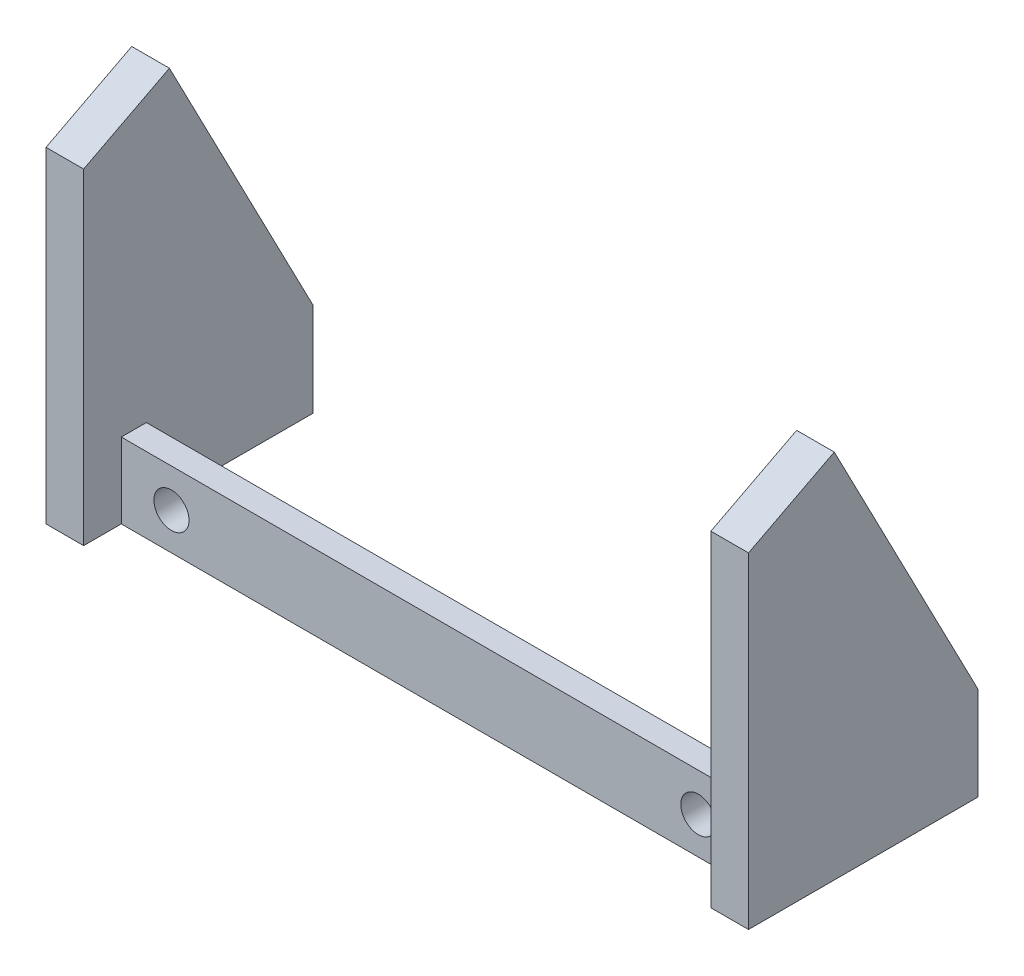
ISO-10303-21;
HEADER;
FILE_DESCRIPTION(('STEP AP214'),'2;1');
FILE_NAME('part.step','',(''),(''),'','','');
FILE_SCHEMA(('AUTOMOTIVE_DESIGN { 1 0 10303 214 1 1 1 1 }'));
ENDSEC;
DATA;
#1=APPLICATION_CONTEXT('core data for automotive mechanical design processes');
#2=APPLICATION_PROTOCOL_DEFINITION('international standard','automotive_design',2000,#1);
#3=PRODUCT_CONTEXT('',#1,'mechanical');
#4=PRODUCT('Part','Part','',(#3));
#5=PRODUCT_RELATED_PRODUCT_CATEGORY('part','',(#4));
#6=PRODUCT_DEFINITION_FORMATION('','',#4);
#7=PRODUCT_DEFINITION_CONTEXT('part definition',#1,'design');
#8=PRODUCT_DEFINITION('design','',#6,#7);
#9=PRODUCT_DEFINITION_SHAPE('','',#8);
#10=(LENGTH_UNIT() NAMED_UNIT(*) SI_UNIT(.MILLI.,.METRE.));
#11=(NAMED_UNIT(*) PLANE_ANGLE_UNIT() SI_UNIT($,.RADIAN.));
#12=(NAMED_UNIT(*) SI_UNIT($,.STERADIAN.) SOLID_ANGLE_UNIT());
#13=UNCERTAINTY_MEASURE_WITH_UNIT(LENGTH_MEASURE(1.E-05),#10,'distance_accuracy_value','');
#14=(GEOMETRIC_REPRESENTATION_CONTEXT(3) GLOBAL_UNCERTAINTY_ASSIGNED_CONTEXT((#13)) GLOBAL_UNIT_ASSIGNED_CONTEXT((#10,
#11,#12)) REPRESENTATION_CONTEXT('',''));
#15=CARTESIAN_POINT('',(0.,0.,0.));
#16=DIRECTION('',(0.,0.,1.));
#17=DIRECTION('',(1.,0.,0.));
#18=AXIS2_PLACEMENT_3D('',#15,#16,#17);
#19=CARTESIAN_POINT('',(3.,81.5205427840225,47.1061323483596));
#20=DIRECTION('',(0.,-0.887763580459995,-0.460299712371026));
#21=DIRECTION('',(0.,0.460299712371026,-0.887763580459995));
#22=AXIS2_PLACEMENT_3D('',#19,#20,#21);
#23=PLANE('',#22);
#24=DIRECTION('',(0.,-0.460299712371026,0.887763580459995));
#25=VECTOR('',#24,1.);
#26=CARTESIAN_POINT('',(0.,81.5205427840225,47.1061323483596));
#27=LINE('',#26,#25);
#28=CARTESIAN_POINT('',(0.,81.5205427840225,47.1061323483596));
#29=VERTEX_POINT('',#28);
#30=CARTESIAN_POINT('',(0.,77.9762349987656,53.9419119179015));
#31=VERTEX_POINT('',#30);
#32=EDGE_CURVE('E190',#29,#31,#27,.T.);
#33=ORIENTED_EDGE('',*,*,#32,.T.);
#34=DIRECTION('',(-1.,0.,0.));
#35=VECTOR('',#34,1.);
#36=CARTESIAN_POINT('',(3.,77.9762349987656,53.9419119179015));
#37=LINE('',#36,#35);
#38=CARTESIAN_POINT('',(3.,77.9762349987656,53.9419119179015));
#39=VERTEX_POINT('',#38);
#40=EDGE_CURVE('E11',#39,#31,#37,.T.);
#41=ORIENTED_EDGE('',*,*,#40,.F.);
#42=DIRECTION('',(0.,-0.460299712371026,0.887763580459995));
#43=VECTOR('',#42,1.);
#44=CARTESIAN_POINT('',(3.,81.5205427840225,47.1061323483596));
#45=LINE('',#44,#43);
#46=CARTESIAN_POINT('',(3.,81.5205427840225,47.1061323483596));
#47=VERTEX_POINT('',#46);
#48=EDGE_CURVE('E196',#47,#39,#45,.T.);
#49=ORIENTED_EDGE('',*,*,#48,.F.);
#50=DIRECTION('',(-1.,0.,0.));
#51=VECTOR('',#50,1.);
#52=CARTESIAN_POINT('',(3.,81.5205427840225,47.1061323483596));
#53=LINE('',#52,#51);
#54=EDGE_CURVE('E209',#47,#29,#53,.T.);
#55=ORIENTED_EDGE('',*,*,#54,.T.);
#56=EDGE_LOOP('',(#33,#41,#49,#55));
#57=FACE_BOUND('',#56,.T.);
#58=ADVANCED_FACE('F41',(#57),#23,.F.);
#59=CARTESIAN_POINT('',(3.,51.9762349987656,53.9419119179015));
#60=DIRECTION('',(0.,0.,-1.));
#61=DIRECTION('',(-1.,0.,0.));
#62=AXIS2_PLACEMENT_3D('',#59,#60,#61);
#63=PLANE('',#62);
#64=DIRECTION('',(0.,-1.,0.));
#65=VECTOR('',#64,1.);
#66=CARTESIAN_POINT('',(0.,51.9762349987656,53.9419119179015));
#67=LINE('',#66,#65);
#68=CARTESIAN_POINT('',(0.,51.9762349987656,53.9419119179015));
#69=VERTEX_POINT('',#68);
#70=EDGE_CURVE('E212',#31,#69,#67,.T.);
#71=ORIENTED_EDGE('',*,*,#70,.T.);
#72=DIRECTION('',(-1.,0.,0.));
#73=VECTOR('',#72,1.);
#74=CARTESIAN_POINT('',(3.,51.9762349987656,53.9419119179015));
#75=LINE('',#74,#73);
#76=CARTESIAN_POINT('',(3.,51.9762349987656,53.9419119179015));
#77=VERTEX_POINT('',#76);
#78=EDGE_CURVE('E48',#77,#69,#75,.T.);
#79=ORIENTED_EDGE('',*,*,#78,.F.);
#80=DIRECTION('',(0.,-1.,0.));
#81=VECTOR('',#80,1.);
#82=CARTESIAN_POINT('',(3.,51.9762349987656,53.9419119179015));
#83=LINE('',#82,#81);
#84=EDGE_CURVE('E199',#39,#77,#83,.T.);
#85=ORIENTED_EDGE('',*,*,#84,.F.);
#86=ORIENTED_EDGE('',*,*,#40,.T.);
#87=EDGE_LOOP('',(#71,#79,#85,#86));
#88=FACE_BOUND('',#87,.T.);
#89=ADVANCED_FACE('F299',(#88),#63,.F.);
#90=CARTESIAN_POINT('',(3.,51.9762349987656,35.6483878504032));
#91=DIRECTION('',(0.,1.,0.));
#92=DIRECTION('',(0.,0.,1.));
#93=AXIS2_PLACEMENT_3D('',#90,#91,#92);
#94=PLANE('',#93);
#95=DIRECTION('',(0.,0.,-1.));
#96=VECTOR('',#95,1.);
#97=CARTESIAN_POINT('',(0.,51.9762349987656,35.6483878504032));
#98=LINE('',#97,#96);
#99=CARTESIAN_POINT('',(0.,51.9762349987656,35.6483878504032));
#100=VERTEX_POINT('',#99);
#101=EDGE_CURVE('E214',#69,#100,#98,.T.);
#102=ORIENTED_EDGE('',*,*,#101,.T.);
#103=DIRECTION('',(-1.,0.,0.));
#104=VECTOR('',#103,1.);
#105=CARTESIAN_POINT('',(3.,51.9762349987656,35.6483878504032));
#106=LINE('',#105,#104);
#107=CARTESIAN_POINT('',(3.,51.9762349987656,35.6483878504032));
#108=VERTEX_POINT('',#107);
#109=EDGE_CURVE('E224',#108,#100,#106,.T.);
#110=ORIENTED_EDGE('',*,*,#109,.F.);
#111=DIRECTION('',(0.,0.,-1.));
#112=VECTOR('',#111,1.);
#113=CARTESIAN_POINT('',(3.,51.9762349987656,35.6483878504032));
#114=LINE('',#113,#112);
#115=CARTESIAN_POINT('',(3.,51.9762349987656,48.9419119179015));
#116=VERTEX_POINT('',#115);
#117=EDGE_CURVE('E202',#116,#108,#114,.T.);
#118=ORIENTED_EDGE('',*,*,#117,.F.);
#119=DIRECTION('',(-1.,0.,0.));
#120=VECTOR('',#119,1.);
#121=CARTESIAN_POINT('',(56.002,51.9762349987656,48.9419119179015));
#122=LINE('',#121,#120);
#123=CARTESIAN_POINT('',(53.,51.9762349987656,48.9419119179015));
#124=VERTEX_POINT('',#123);
#125=EDGE_CURVE('E180',#124,#116,#122,.T.);
#126=ORIENTED_EDGE('',*,*,#125,.F.);
#127=DIRECTION('',(0.,0.,-1.));
#128=VECTOR('',#127,1.);
#129=CARTESIAN_POINT('',(53.,51.9762349987656,53.9419119179015));
#130=LINE('',#129,#128);
#131=CARTESIAN_POINT('',(53.,51.9762349987656,35.6483878504032));
#132=VERTEX_POINT('',#131);
#133=EDGE_CURVE('E258',#124,#132,#130,.T.);
#134=ORIENTED_EDGE('',*,*,#133,.T.);
#135=DIRECTION('',(-1.,0.,0.));
#136=VECTOR('',#135,1.);
#137=CARTESIAN_POINT('',(56.,51.9762349987656,35.6483878504032));
#138=LINE('',#137,#136);
#139=CARTESIAN_POINT('',(56.,51.9762349987656,35.6483878504032));
#140=VERTEX_POINT('',#139);
#141=EDGE_CURVE('E272',#140,#132,#138,.T.);
#142=ORIENTED_EDGE('',*,*,#141,.F.);
#143=DIRECTION('',(0.,0.,-1.));
#144=VECTOR('',#143,1.);
#145=CARTESIAN_POINT('',(56.,51.9762349987656,53.9419119179015));
#146=LINE('',#145,#144);
#147=CARTESIAN_POINT('',(56.,51.9762349987656,53.9419119179015));
#148=VERTEX_POINT('',#147);
#149=EDGE_CURVE('E277',#148,#140,#146,.T.);
#150=ORIENTED_EDGE('',*,*,#149,.F.);
#151=DIRECTION('',(-1.,0.,0.));
#152=VECTOR('',#151,1.);
#153=CARTESIAN_POINT('',(56.,51.9762349987656,53.9419119179015));
#154=LINE('',#153,#152);
#155=CARTESIAN_POINT('',(53.,51.9762349987656,53.9419119179015));
#156=VERTEX_POINT('',#155);
#157=EDGE_CURVE('E168',#148,#156,#154,.T.);
#158=ORIENTED_EDGE('',*,*,#157,.T.);
#159=CARTESIAN_POINT('',(53.,51.9762349987656,50.9419119179015));
#160=VERTEX_POINT('',#159);
#161=EDGE_CURVE('E261',#156,#160,#130,.T.);
#162=ORIENTED_EDGE('',*,*,#161,.T.);
#163=DIRECTION('',(-1.,0.,0.));
#164=VECTOR('',#163,1.);
#165=CARTESIAN_POINT('',(56.002,51.9762349987656,50.9419119179015));
#166=LINE('',#165,#164);
#167=CARTESIAN_POINT('',(3.,51.9762349987656,50.9419119179015));
#168=VERTEX_POINT('',#167);
#169=EDGE_CURVE('E183',#160,#168,#166,.T.);
#170=ORIENTED_EDGE('',*,*,#169,.T.);
#171=EDGE_CURVE('E203',#77,#168,#114,.T.);
#172=ORIENTED_EDGE('',*,*,#171,.F.);
#173=ORIENTED_EDGE('',*,*,#78,.T.);
#174=EDGE_LOOP('',(#102,#110,#118,#126,#134,#142,#150,#158,#162,#170,#172,#173));
#175=FACE_BOUND('',#174,.T.);
#176=ADVANCED_FACE('F231',(#175),#94,.F.);
#177=CARTESIAN_POINT('',(3.,59.4224010600003,35.6483878504032));
#178=DIRECTION('',(0.,0.,1.));
#179=DIRECTION('',(0.,-1.,0.));
#180=AXIS2_PLACEMENT_3D('',#177,#178,#179);
#181=PLANE('',#180);
#182=DIRECTION('',(0.,1.,0.));
#183=VECTOR('',#182,1.);
#184=CARTESIAN_POINT('',(0.,59.4224010600003,35.6483878504032));
#185=LINE('',#184,#183);
#186=CARTESIAN_POINT('',(0.,59.4224010600003,35.6483878504032));
#187=VERTEX_POINT('',#186);
#188=EDGE_CURVE('E216',#100,#187,#185,.T.);
#189=ORIENTED_EDGE('',*,*,#188,.T.);
#190=DIRECTION('',(-1.,0.,0.));
#191=VECTOR('',#190,1.);
#192=CARTESIAN_POINT('',(3.,59.4224010600003,35.6483878504032));
#193=LINE('',#192,#191);
#194=CARTESIAN_POINT('',(3.,59.4224010600003,35.6483878504032));
#195=VERTEX_POINT('',#194);
#196=EDGE_CURVE('E221',#195,#187,#193,.T.);
#197=ORIENTED_EDGE('',*,*,#196,.F.);
#198=DIRECTION('',(0.,1.,0.));
#199=VECTOR('',#198,1.);
#200=CARTESIAN_POINT('',(3.,59.4224010600003,35.6483878504032));
#201=LINE('',#200,#199);
#202=EDGE_CURVE('E205',#108,#195,#201,.T.);
#203=ORIENTED_EDGE('',*,*,#202,.F.);
#204=ORIENTED_EDGE('',*,*,#109,.T.);
#205=EDGE_LOOP('',(#189,#197,#203,#204));
#206=FACE_BOUND('',#205,.T.);
#207=ADVANCED_FACE('F241',(#206),#181,.F.);
#208=CARTESIAN_POINT('',(3.,81.5205427840225,47.1061323483596));
#209=DIRECTION('',(0.,-0.460299712371026,0.887763580459995));
#210=DIRECTION('',(0.,-0.887763580459995,-0.460299712371026));
#211=AXIS2_PLACEMENT_3D('',#208,#209,#210);
#212=PLANE('',#211);
#213=DIRECTION('',(0.,0.887763580459995,0.460299712371026));
#214=VECTOR('',#213,1.);
#215=CARTESIAN_POINT('',(0.,81.5205427840225,47.1061323483596));
#216=LINE('',#215,#214);
#217=EDGE_CURVE('E200',#187,#29,#216,.T.);
#218=ORIENTED_EDGE('',*,*,#217,.T.);
#219=ORIENTED_EDGE('',*,*,#54,.F.);
#220=DIRECTION('',(0.,0.887763580459995,0.460299712371026));
#221=VECTOR('',#220,1.);
#222=CARTESIAN_POINT('',(3.,81.5205427840225,47.1061323483596));
#223=LINE('',#222,#221);
#224=EDGE_CURVE('E207',#195,#47,#223,.T.);
#225=ORIENTED_EDGE('',*,*,#224,.F.);
#226=ORIENTED_EDGE('',*,*,#196,.T.);
#227=EDGE_LOOP('',(#218,#219,#225,#226));
#228=FACE_BOUND('',#227,.T.);
#229=ADVANCED_FACE('F245',(#228),#212,.F.);
#230=CARTESIAN_POINT('',(3.,0.,0.));
#231=DIRECTION('',(1.,0.,0.));
#232=DIRECTION('',(0.,0.,-1.));
#233=AXIS2_PLACEMENT_3D('',#230,#231,#232);
#234=PLANE('',#233);
#235=DIRECTION('',(0.,-1.,0.));
#236=VECTOR('',#235,1.);
#237=CARTESIAN_POINT('',(3.,51.9762349987656,50.9419119179015));
#238=LINE('',#237,#236);
#239=CARTESIAN_POINT('',(3.,57.9762349987656,50.9419119179015));
#240=VERTEX_POINT('',#239);
#241=EDGE_CURVE('E55',#240,#168,#238,.T.);
#242=ORIENTED_EDGE('',*,*,#241,.F.);
#243=DIRECTION('',(0.,0.,1.));
#244=VECTOR('',#243,1.);
#245=CARTESIAN_POINT('',(3.,57.9762349987656,50.9419119179015));
#246=LINE('',#245,#244);
#247=CARTESIAN_POINT('',(3.,57.9762349987656,48.9419119179015));
#248=VERTEX_POINT('',#247);
#249=EDGE_CURVE('E166',#248,#240,#246,.T.);
#250=ORIENTED_EDGE('',*,*,#249,.F.);
#251=DIRECTION('',(0.,1.,0.));
#252=VECTOR('',#251,1.);
#253=CARTESIAN_POINT('',(3.,51.9762349987656,48.9419119179015));
#254=LINE('',#253,#252);
#255=EDGE_CURVE('E61',#116,#248,#254,.T.);
#256=ORIENTED_EDGE('',*,*,#255,.F.);
#257=ORIENTED_EDGE('',*,*,#117,.T.);
#258=ORIENTED_EDGE('',*,*,#202,.T.);
#259=ORIENTED_EDGE('',*,*,#224,.T.);
#260=ORIENTED_EDGE('',*,*,#48,.T.);
#261=ORIENTED_EDGE('',*,*,#84,.T.);
#262=ORIENTED_EDGE('',*,*,#171,.T.);
#263=EDGE_LOOP('',(#242,#250,#256,#257,#258,#259,#260,#261,#262));
#264=FACE_BOUND('',#263,.T.);
#265=ADVANCED_FACE('F248',(#264),#234,.T.);
#266=CARTESIAN_POINT('',(0.,0.,0.));
#267=DIRECTION('',(1.,0.,0.));
#268=DIRECTION('',(0.,0.,-1.));
#269=AXIS2_PLACEMENT_3D('',#266,#267,#268);
#270=PLANE('',#269);
#271=ORIENTED_EDGE('',*,*,#32,.F.);
#272=ORIENTED_EDGE('',*,*,#217,.F.);
#273=ORIENTED_EDGE('',*,*,#188,.F.);
#274=ORIENTED_EDGE('',*,*,#101,.F.);
#275=ORIENTED_EDGE('',*,*,#70,.F.);
#276=EDGE_LOOP('',(#271,#272,#273,#274,#275));
#277=FACE_BOUND('',#276,.T.);
#278=ADVANCED_FACE('F237',(#277),#270,.F.);
#279=CARTESIAN_POINT('',(56.002,51.9762349987656,50.9419119179015));
#280=DIRECTION('',(0.,0.,-1.));
#281=DIRECTION('',(-1.,0.,0.));
#282=AXIS2_PLACEMENT_3D('',#279,#280,#281);
#283=PLANE('',#282);
#284=CARTESIAN_POINT('',(49.,54.9238538445279,50.9419119179015));
#285=DIRECTION('',(0.,0.,-1.));
#286=DIRECTION('',(-1.,0.,0.));
#287=AXIS2_PLACEMENT_3D('',#284,#285,#286);
#288=CIRCLE('',#287,1.4);
#289=CARTESIAN_POINT('',(47.6,54.9238538445279,50.9419119179015));
#290=VERTEX_POINT('',#289);
#291=EDGE_CURVE('E321',#290,#290,#288,.F.);
#292=ORIENTED_EDGE('',*,*,#291,.F.);
#293=EDGE_LOOP('',(#292));
#294=FACE_BOUND('',#293,.T.);
#295=CARTESIAN_POINT('',(7.,54.9238538445279,50.9419119179015));
#296=DIRECTION('',(0.,0.,-1.));
#297=DIRECTION('',(-1.,0.,0.));
#298=AXIS2_PLACEMENT_3D('',#295,#296,#297);
#299=CIRCLE('',#298,1.4);
#300=CARTESIAN_POINT('',(5.6,54.9238538445279,50.9419119179015));
#301=VERTEX_POINT('',#300);
#302=EDGE_CURVE('E324',#301,#301,#299,.F.);
#303=ORIENTED_EDGE('',*,*,#302,.F.);
#304=EDGE_LOOP('',(#303));
#305=FACE_BOUND('',#304,.T.);
#306=DIRECTION('',(0.,-1.,0.));
#307=VECTOR('',#306,1.);
#308=CARTESIAN_POINT('',(53.,51.9762349987656,50.9419119179015));
#309=LINE('',#308,#307);
#310=CARTESIAN_POINT('',(53.,57.9762349987656,50.9419119179015));
#311=VERTEX_POINT('',#310);
#312=EDGE_CURVE('E186',#311,#160,#309,.T.);
#313=ORIENTED_EDGE('',*,*,#312,.F.);
#314=DIRECTION('',(-1.,0.,0.));
#315=VECTOR('',#314,1.);
#316=CARTESIAN_POINT('',(56.002,57.9762349987656,50.9419119179015));
#317=LINE('',#316,#315);
#318=EDGE_CURVE('E173',#311,#240,#317,.T.);
#319=ORIENTED_EDGE('',*,*,#318,.T.);
#320=ORIENTED_EDGE('',*,*,#241,.T.);
#321=ORIENTED_EDGE('',*,*,#169,.F.);
#322=EDGE_LOOP('',(#313,#319,#320,#321));
#323=FACE_BOUND('',#322,.T.);
#324=ADVANCED_FACE('F282',(#294,#305,#323),#283,.F.);
#325=CARTESIAN_POINT('',(56.002,51.9762349987656,48.9419119179015));
#326=DIRECTION('',(0.,0.,1.));
#327=DIRECTION('',(1.,0.,0.));
#328=AXIS2_PLACEMENT_3D('',#325,#326,#327);
#329=PLANE('',#328);
#330=CARTESIAN_POINT('',(49.,54.9238538445279,48.9419119179015));
#331=DIRECTION('',(0.,0.,-1.));
#332=DIRECTION('',(-1.,0.,0.));
#333=AXIS2_PLACEMENT_3D('',#330,#331,#332);
#334=CIRCLE('',#333,1.4);
#335=CARTESIAN_POINT('',(47.6,54.9238538445279,48.9419119179015));
#336=VERTEX_POINT('',#335);
#337=EDGE_CURVE('E329',#336,#336,#334,.T.);
#338=ORIENTED_EDGE('',*,*,#337,.F.);
#339=EDGE_LOOP('',(#338));
#340=FACE_BOUND('',#339,.T.);
#341=CARTESIAN_POINT('',(7.,54.9238538445279,48.9419119179015));
#342=DIRECTION('',(0.,0.,-1.));
#343=DIRECTION('',(-1.,0.,0.));
#344=AXIS2_PLACEMENT_3D('',#341,#342,#343);
#345=CIRCLE('',#344,1.4);
#346=CARTESIAN_POINT('',(5.6,54.9238538445279,48.9419119179015));
#347=VERTEX_POINT('',#346);
#348=EDGE_CURVE('E326',#347,#347,#345,.T.);
#349=ORIENTED_EDGE('',*,*,#348,.F.);
#350=EDGE_LOOP('',(#349));
#351=FACE_BOUND('',#350,.T.);
#352=DIRECTION('',(0.,1.,0.));
#353=VECTOR('',#352,1.);
#354=CARTESIAN_POINT('',(53.,51.9762349987656,48.9419119179015));
#355=LINE('',#354,#353);
#356=CARTESIAN_POINT('',(53.,57.9762349987656,48.9419119179015));
#357=VERTEX_POINT('',#356);
#358=EDGE_CURVE('E191',#124,#357,#355,.T.);
#359=ORIENTED_EDGE('',*,*,#358,.F.);
#360=ORIENTED_EDGE('',*,*,#125,.T.);
#361=ORIENTED_EDGE('',*,*,#255,.T.);
#362=DIRECTION('',(-1.,0.,0.));
#363=VECTOR('',#362,1.);
#364=CARTESIAN_POINT('',(56.002,57.9762349987656,48.9419119179015));
#365=LINE('',#364,#363);
#366=EDGE_CURVE('E177',#357,#248,#365,.T.);
#367=ORIENTED_EDGE('',*,*,#366,.F.);
#368=EDGE_LOOP('',(#359,#360,#361,#367));
#369=FACE_BOUND('',#368,.T.);
#370=ADVANCED_FACE('F253',(#340,#351,#369),#329,.F.);
#371=CARTESIAN_POINT('',(56.002,57.9762349987656,50.9419119179015));
#372=DIRECTION('',(0.,-1.,0.));
#373=DIRECTION('',(0.,0.,-1.));
#374=AXIS2_PLACEMENT_3D('',#371,#372,#373);
#375=PLANE('',#374);
#376=DIRECTION('',(0.,0.,1.));
#377=VECTOR('',#376,1.);
#378=CARTESIAN_POINT('',(53.,57.9762349987656,50.9419119179015));
#379=LINE('',#378,#377);
#380=EDGE_CURVE('E187',#357,#311,#379,.T.);
#381=ORIENTED_EDGE('',*,*,#380,.F.);
#382=ORIENTED_EDGE('',*,*,#366,.T.);
#383=ORIENTED_EDGE('',*,*,#249,.T.);
#384=ORIENTED_EDGE('',*,*,#318,.F.);
#385=EDGE_LOOP('',(#381,#382,#383,#384));
#386=FACE_BOUND('',#385,.T.);
#387=ADVANCED_FACE('F284',(#386),#375,.F.);
#388=CARTESIAN_POINT('',(53.,0.,0.));
#389=DIRECTION('',(1.,0.,0.));
#390=DIRECTION('',(0.,0.,-1.));
#391=AXIS2_PLACEMENT_3D('',#388,#389,#390);
#392=PLANE('',#391);
#393=ORIENTED_EDGE('',*,*,#380,.T.);
#394=ORIENTED_EDGE('',*,*,#312,.T.);
#395=ORIENTED_EDGE('',*,*,#161,.F.);
#396=DIRECTION('',(0.,-1.,0.));
#397=VECTOR('',#396,1.);
#398=CARTESIAN_POINT('',(53.,77.9762349987656,53.9419119179015));
#399=LINE('',#398,#397);
#400=CARTESIAN_POINT('',(53.,77.9762349987656,53.9419119179015));
#401=VERTEX_POINT('',#400);
#402=EDGE_CURVE('E262',#401,#156,#399,.T.);
#403=ORIENTED_EDGE('',*,*,#402,.F.);
#404=DIRECTION('',(0.,-0.460299712371026,0.887763580459995));
#405=VECTOR('',#404,1.);
#406=CARTESIAN_POINT('',(53.,81.5205427840225,47.1061323483596));
#407=LINE('',#406,#405);
#408=CARTESIAN_POINT('',(53.,81.5205427840225,47.1061323483596));
#409=VERTEX_POINT('',#408);
#410=EDGE_CURVE('E265',#409,#401,#407,.T.);
#411=ORIENTED_EDGE('',*,*,#410,.F.);
#412=DIRECTION('',(0.,0.887763580459995,0.460299712371026));
#413=VECTOR('',#412,1.);
#414=CARTESIAN_POINT('',(53.,59.4224010600003,35.6483878504032));
#415=LINE('',#414,#413);
#416=CARTESIAN_POINT('',(53.,59.4224010600003,35.6483878504032));
#417=VERTEX_POINT('',#416);
#418=EDGE_CURVE('E164',#417,#409,#415,.T.);
#419=ORIENTED_EDGE('',*,*,#418,.F.);
#420=DIRECTION('',(0.,1.,0.));
#421=VECTOR('',#420,1.);
#422=CARTESIAN_POINT('',(53.,51.9762349987656,35.6483878504032));
#423=LINE('',#422,#421);
#424=EDGE_CURVE('E160',#132,#417,#423,.T.);
#425=ORIENTED_EDGE('',*,*,#424,.F.);
#426=ORIENTED_EDGE('',*,*,#133,.F.);
#427=ORIENTED_EDGE('',*,*,#358,.T.);
#428=EDGE_LOOP('',(#393,#394,#395,#403,#411,#419,#425,#426,#427));
#429=FACE_BOUND('',#428,.T.);
#430=ADVANCED_FACE('F256',(#429),#392,.F.);
#431=CARTESIAN_POINT('',(56.,59.4224010600003,35.6483878504032));
#432=DIRECTION('',(0.,-0.460299712371026,0.887763580459995));
#433=DIRECTION('',(0.,-0.887763580459995,-0.460299712371026));
#434=AXIS2_PLACEMENT_3D('',#431,#432,#433);
#435=PLANE('',#434);
#436=ORIENTED_EDGE('',*,*,#418,.T.);
#437=DIRECTION('',(-1.,0.,0.));
#438=VECTOR('',#437,1.);
#439=CARTESIAN_POINT('',(56.,81.5205427840225,47.1061323483596));
#440=LINE('',#439,#438);
#441=CARTESIAN_POINT('',(56.,81.5205427840225,47.1061323483596));
#442=VERTEX_POINT('',#441);
#443=EDGE_CURVE('E144',#442,#409,#440,.T.);
#444=ORIENTED_EDGE('',*,*,#443,.F.);
#445=DIRECTION('',(0.,0.887763580459995,0.460299712371026));
#446=VECTOR('',#445,1.);
#447=CARTESIAN_POINT('',(56.,59.4224010600003,35.6483878504032));
#448=LINE('',#447,#446);
#449=CARTESIAN_POINT('',(56.,59.4224010600003,35.6483878504032));
#450=VERTEX_POINT('',#449);
#451=EDGE_CURVE('E151',#450,#442,#448,.T.);
#452=ORIENTED_EDGE('',*,*,#451,.F.);
#453=DIRECTION('',(-1.,0.,0.));
#454=VECTOR('',#453,1.);
#455=CARTESIAN_POINT('',(56.,59.4224010600003,35.6483878504032));
#456=LINE('',#455,#454);
#457=EDGE_CURVE('E270',#450,#417,#456,.T.);
#458=ORIENTED_EDGE('',*,*,#457,.T.);
#459=EDGE_LOOP('',(#436,#444,#452,#458));
#460=FACE_BOUND('',#459,.T.);
#461=ADVANCED_FACE('F162',(#460),#435,.F.);
#462=CARTESIAN_POINT('',(56.,81.5205427840225,47.1061323483596));
#463=DIRECTION('',(0.,-0.887763580459995,-0.460299712371026));
#464=DIRECTION('',(0.,0.460299712371026,-0.887763580459995));
#465=AXIS2_PLACEMENT_3D('',#462,#463,#464);
#466=PLANE('',#465);
#467=ORIENTED_EDGE('',*,*,#410,.T.);
#468=DIRECTION('',(-1.,0.,0.));
#469=VECTOR('',#468,1.);
#470=CARTESIAN_POINT('',(56.,77.9762349987656,53.9419119179015));
#471=LINE('',#470,#469);
#472=CARTESIAN_POINT('',(56.,77.9762349987656,53.9419119179015));
#473=VERTEX_POINT('',#472);
#474=EDGE_CURVE('E147',#473,#401,#471,.T.);
#475=ORIENTED_EDGE('',*,*,#474,.F.);
#476=DIRECTION('',(0.,-0.460299712371026,0.887763580459995));
#477=VECTOR('',#476,1.);
#478=CARTESIAN_POINT('',(56.,81.5205427840225,47.1061323483596));
#479=LINE('',#478,#477);
#480=EDGE_CURVE('E140',#442,#473,#479,.T.);
#481=ORIENTED_EDGE('',*,*,#480,.F.);
#482=ORIENTED_EDGE('',*,*,#443,.T.);
#483=EDGE_LOOP('',(#467,#475,#481,#482));
#484=FACE_BOUND('',#483,.T.);
#485=ADVANCED_FACE('F142',(#484),#466,.F.);
#486=CARTESIAN_POINT('',(56.,77.9762349987656,53.9419119179015));
#487=DIRECTION('',(0.,0.,-1.));
#488=DIRECTION('',(-1.,0.,0.));
#489=AXIS2_PLACEMENT_3D('',#486,#487,#488);
#490=PLANE('',#489);
#491=ORIENTED_EDGE('',*,*,#402,.T.);
#492=ORIENTED_EDGE('',*,*,#157,.F.);
#493=DIRECTION('',(0.,-1.,0.));
#494=VECTOR('',#493,1.);
#495=CARTESIAN_POINT('',(56.,77.9762349987656,53.9419119179015));
#496=LINE('',#495,#494);
#497=EDGE_CURVE('E150',#473,#148,#496,.T.);
#498=ORIENTED_EDGE('',*,*,#497,.F.);
#499=ORIENTED_EDGE('',*,*,#474,.T.);
#500=EDGE_LOOP('',(#491,#492,#498,#499));
#501=FACE_BOUND('',#500,.T.);
#502=ADVANCED_FACE('F337',(#501),#490,.F.);
#503=CARTESIAN_POINT('',(56.,51.9762349987656,35.6483878504032));
#504=DIRECTION('',(0.,0.,1.));
#505=DIRECTION('',(0.,-1.,0.));
#506=AXIS2_PLACEMENT_3D('',#503,#504,#505);
#507=PLANE('',#506);
#508=ORIENTED_EDGE('',*,*,#424,.T.);
#509=ORIENTED_EDGE('',*,*,#457,.F.);
#510=DIRECTION('',(0.,1.,0.));
#511=VECTOR('',#510,1.);
#512=CARTESIAN_POINT('',(56.,51.9762349987656,35.6483878504032));
#513=LINE('',#512,#511);
#514=EDGE_CURVE('E156',#140,#450,#513,.T.);
#515=ORIENTED_EDGE('',*,*,#514,.F.);
#516=ORIENTED_EDGE('',*,*,#141,.T.);
#517=EDGE_LOOP('',(#508,#509,#515,#516));
#518=FACE_BOUND('',#517,.T.);
#519=ADVANCED_FACE('F339',(#518),#507,.F.);
#520=CARTESIAN_POINT('',(56.,0.,0.));
#521=DIRECTION('',(1.,0.,0.));
#522=DIRECTION('',(0.,0.,-1.));
#523=AXIS2_PLACEMENT_3D('',#520,#521,#522);
#524=PLANE('',#523);
#525=ORIENTED_EDGE('',*,*,#451,.T.);
#526=ORIENTED_EDGE('',*,*,#480,.T.);
#527=ORIENTED_EDGE('',*,*,#497,.T.);
#528=ORIENTED_EDGE('',*,*,#149,.T.);
#529=ORIENTED_EDGE('',*,*,#514,.T.);
#530=EDGE_LOOP('',(#525,#526,#527,#528,#529));
#531=FACE_BOUND('',#530,.T.);
#532=ADVANCED_FACE('F154',(#531),#524,.T.);
#533=CARTESIAN_POINT('',(7.,54.9238538445279,53.9429119179015));
#534=DIRECTION('',(0.,0.,-1.));
#535=DIRECTION('',(-1.,0.,0.));
#536=AXIS2_PLACEMENT_3D('',#533,#534,#535);
#537=CYLINDRICAL_SURFACE('',#536,1.4);
#538=ORIENTED_EDGE('',*,*,#348,.T.);
#539=EDGE_LOOP('',(#538));
#540=FACE_BOUND('',#539,.T.);
#541=ORIENTED_EDGE('',*,*,#302,.T.);
#542=EDGE_LOOP('',(#541));
#543=FACE_BOUND('',#542,.T.);
#544=ADVANCED_FACE('F345',(#540,#543),#537,.F.);
#545=CARTESIAN_POINT('',(49.,54.9238538445279,53.9429119179015));
#546=DIRECTION('',(0.,0.,-1.));
#547=DIRECTION('',(-1.,0.,0.));
#548=AXIS2_PLACEMENT_3D('',#545,#546,#547);
#549=CYLINDRICAL_SURFACE('',#548,1.4);
#550=ORIENTED_EDGE('',*,*,#337,.T.);
#551=EDGE_LOOP('',(#550));
#552=FACE_BOUND('',#551,.T.);
#553=ORIENTED_EDGE('',*,*,#291,.T.);
#554=EDGE_LOOP('',(#553));
#555=FACE_BOUND('',#554,.T.);
#556=ADVANCED_FACE('F399',(#552,#555),#549,.F.);
#557=CLOSED_SHELL('',(#58,#89,#176,#207,#229,#265,#278,#324,#370,#387,#430,#461,#485,#502,#519,
#532,#544,#556));
#558=MANIFOLD_SOLID_BREP('B2',#557);
#559=ADVANCED_BREP_SHAPE_REPRESENTATION('',(#18,#558),#14);
#560=SHAPE_DEFINITION_REPRESENTATION(#9,#559);
ENDSEC;
END-ISO-10303-21;
